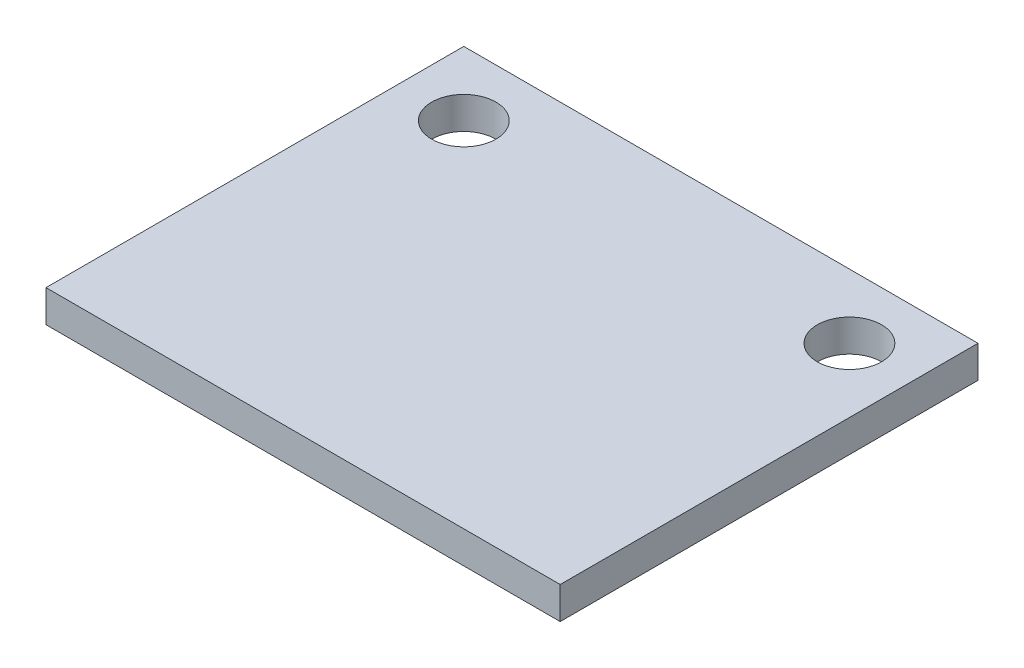
ISO-10303-21;
HEADER;
FILE_DESCRIPTION(('STEP AP214'),'2;1');
FILE_NAME('part.step','',(''),(''),'','','');
FILE_SCHEMA(('AUTOMOTIVE_DESIGN { 1 0 10303 214 1 1 1 1 }'));
ENDSEC;
DATA;
#1=APPLICATION_CONTEXT('core data for automotive mechanical design processes');
#2=APPLICATION_PROTOCOL_DEFINITION('international standard','automotive_design',2000,#1);
#3=PRODUCT_CONTEXT('',#1,'mechanical');
#4=PRODUCT('Part','Part','',(#3));
#5=PRODUCT_RELATED_PRODUCT_CATEGORY('part','',(#4));
#6=PRODUCT_DEFINITION_FORMATION('','',#4);
#7=PRODUCT_DEFINITION_CONTEXT('part definition',#1,'design');
#8=PRODUCT_DEFINITION('design','',#6,#7);
#9=PRODUCT_DEFINITION_SHAPE('','',#8);
#10=(LENGTH_UNIT() NAMED_UNIT(*) SI_UNIT(.MILLI.,.METRE.));
#11=(NAMED_UNIT(*) PLANE_ANGLE_UNIT() SI_UNIT($,.RADIAN.));
#12=(NAMED_UNIT(*) SI_UNIT($,.STERADIAN.) SOLID_ANGLE_UNIT());
#13=UNCERTAINTY_MEASURE_WITH_UNIT(LENGTH_MEASURE(1.E-05),#10,'distance_accuracy_value','');
#14=(GEOMETRIC_REPRESENTATION_CONTEXT(3) GLOBAL_UNCERTAINTY_ASSIGNED_CONTEXT((#13)) GLOBAL_UNIT_ASSIGNED_CONTEXT((#10,
#11,#12)) REPRESENTATION_CONTEXT('',''));
#15=CARTESIAN_POINT('',(0.,0.,0.));
#16=DIRECTION('',(0.,0.,1.));
#17=DIRECTION('',(1.,0.,0.));
#18=AXIS2_PLACEMENT_3D('',#15,#16,#17);
#19=CARTESIAN_POINT('',(4.00000000000001,2.75,-6.11924196099296));
#20=DIRECTION('',(-1.,0.,0.));
#21=DIRECTION('',(0.,0.,1.));
#22=AXIS2_PLACEMENT_3D('',#19,#20,#21);
#23=PLANE('',#22);
#24=DIRECTION('',(0.,0.,-1.));
#25=VECTOR('',#24,1.);
#26=CARTESIAN_POINT('',(4.00000000000001,2.25,-6.11924196099296));
#27=LINE('',#26,#25);
#28=CARTESIAN_POINT('',(4.00000000000001,2.25,-3.61924196099296));
#29=VERTEX_POINT('',#28);
#30=CARTESIAN_POINT('',(4.00000000000001,2.25,-10.119241960993));
#31=VERTEX_POINT('',#30);
#32=EDGE_CURVE('E121',#29,#31,#27,.T.);
#33=ORIENTED_EDGE('',*,*,#32,.T.);
#34=DIRECTION('',(0.,-1.,0.));
#35=VECTOR('',#34,1.);
#36=CARTESIAN_POINT('',(4.00000000000001,2.75,-10.119241960993));
#37=LINE('',#36,#35);
#38=CARTESIAN_POINT('',(4.00000000000001,2.75,-10.119241960993));
#39=VERTEX_POINT('',#38);
#40=EDGE_CURVE('E11',#39,#31,#37,.T.);
#41=ORIENTED_EDGE('',*,*,#40,.F.);
#42=DIRECTION('',(0.,0.,-1.));
#43=VECTOR('',#42,1.);
#44=CARTESIAN_POINT('',(4.00000000000001,2.75,-6.11924196099296));
#45=LINE('',#44,#43);
#46=CARTESIAN_POINT('',(4.00000000000001,2.75,-3.61924196099296));
#47=VERTEX_POINT('',#46);
#48=EDGE_CURVE('E85',#47,#39,#45,.T.);
#49=ORIENTED_EDGE('',*,*,#48,.F.);
#50=DIRECTION('',(0.,-1.,0.));
#51=VECTOR('',#50,1.);
#52=CARTESIAN_POINT('',(4.00000000000001,2.75,-3.61924196099296));
#53=LINE('',#52,#51);
#54=EDGE_CURVE('E120',#47,#29,#53,.T.);
#55=ORIENTED_EDGE('',*,*,#54,.T.);
#56=EDGE_LOOP('',(#33,#41,#49,#55));
#57=FACE_BOUND('',#56,.T.);
#58=ADVANCED_FACE('F45',(#57),#23,.F.);
#59=CARTESIAN_POINT('',(0.,2.75,-10.119241960993));
#60=DIRECTION('',(0.,0.,-1.));
#61=DIRECTION('',(-1.,0.,0.));
#62=AXIS2_PLACEMENT_3D('',#59,#60,#61);
#63=PLANE('',#62);
#64=DIRECTION('',(1.,0.,0.));
#65=VECTOR('',#64,1.);
#66=CARTESIAN_POINT('',(0.,2.25,-10.119241960993));
#67=LINE('',#66,#65);
#68=CARTESIAN_POINT('',(-3.99999999999999,2.25,-10.119241960993));
#69=VERTEX_POINT('',#68);
#70=EDGE_CURVE('E94',#69,#31,#67,.T.);
#71=ORIENTED_EDGE('',*,*,#70,.F.);
#72=DIRECTION('',(0.,-1.,0.));
#73=VECTOR('',#72,1.);
#74=CARTESIAN_POINT('',(-3.99999999999999,2.75,-10.119241960993));
#75=LINE('',#74,#73);
#76=CARTESIAN_POINT('',(-3.99999999999999,2.75,-10.119241960993));
#77=VERTEX_POINT('',#76);
#78=EDGE_CURVE('E54',#77,#69,#75,.T.);
#79=ORIENTED_EDGE('',*,*,#78,.F.);
#80=DIRECTION('',(1.,0.,0.));
#81=VECTOR('',#80,1.);
#82=CARTESIAN_POINT('',(0.,2.75,-10.119241960993));
#83=LINE('',#82,#81);
#84=EDGE_CURVE('E92',#77,#39,#83,.T.);
#85=ORIENTED_EDGE('',*,*,#84,.T.);
#86=ORIENTED_EDGE('',*,*,#40,.T.);
#87=EDGE_LOOP('',(#71,#79,#85,#86));
#88=FACE_BOUND('',#87,.T.);
#89=ADVANCED_FACE('F91',(#88),#63,.T.);
#90=CARTESIAN_POINT('',(-3.99999999999999,2.75,-6.11924196099296));
#91=DIRECTION('',(-1.,0.,0.));
#92=DIRECTION('',(0.,0.,1.));
#93=AXIS2_PLACEMENT_3D('',#90,#91,#92);
#94=PLANE('',#93);
#95=DIRECTION('',(0.,0.,-1.));
#96=VECTOR('',#95,1.);
#97=CARTESIAN_POINT('',(-3.99999999999999,2.25,-6.11924196099296));
#98=LINE('',#97,#96);
#99=CARTESIAN_POINT('',(-3.99999999999999,2.25,-3.61924196099296));
#100=VERTEX_POINT('',#99);
#101=EDGE_CURVE('E127',#100,#69,#98,.T.);
#102=ORIENTED_EDGE('',*,*,#101,.F.);
#103=DIRECTION('',(0.,-1.,0.));
#104=VECTOR('',#103,1.);
#105=CARTESIAN_POINT('',(-3.99999999999999,2.75,-3.61924196099296));
#106=LINE('',#105,#104);
#107=CARTESIAN_POINT('',(-3.99999999999999,2.75,-3.61924196099296));
#108=VERTEX_POINT('',#107);
#109=EDGE_CURVE('E77',#108,#100,#106,.T.);
#110=ORIENTED_EDGE('',*,*,#109,.F.);
#111=DIRECTION('',(0.,0.,-1.));
#112=VECTOR('',#111,1.);
#113=CARTESIAN_POINT('',(-3.99999999999999,2.75,-6.11924196099296));
#114=LINE('',#113,#112);
#115=EDGE_CURVE('E102',#108,#77,#114,.T.);
#116=ORIENTED_EDGE('',*,*,#115,.T.);
#117=ORIENTED_EDGE('',*,*,#78,.T.);
#118=EDGE_LOOP('',(#102,#110,#116,#117));
#119=FACE_BOUND('',#118,.T.);
#120=ADVANCED_FACE('F105',(#119),#94,.T.);
#121=CARTESIAN_POINT('',(3.00000000000001,2.75,-9.11924196099296));
#122=DIRECTION('',(0.,-1.,0.));
#123=DIRECTION('',(0.,0.,-1.));
#124=AXIS2_PLACEMENT_3D('',#121,#122,#123);
#125=CYLINDRICAL_SURFACE('',#124,0.5);
#126=CARTESIAN_POINT('',(3.00000000000001,2.75,-9.11924196099296));
#127=DIRECTION('',(0.,1.,0.));
#128=DIRECTION('',(0.,0.,1.));
#129=AXIS2_PLACEMENT_3D('',#126,#127,#128);
#130=CIRCLE('',#129,0.5);
#131=CARTESIAN_POINT('',(3.00000000000001,2.75,-8.61924196099296));
#132=VERTEX_POINT('',#131);
#133=EDGE_CURVE('E109',#132,#132,#130,.F.);
#134=ORIENTED_EDGE('',*,*,#133,.F.);
#135=EDGE_LOOP('',(#134));
#136=FACE_BOUND('',#135,.T.);
#137=CARTESIAN_POINT('',(3.00000000000001,2.25,-9.11924196099296));
#138=DIRECTION('',(0.,1.,0.));
#139=DIRECTION('',(0.,0.,1.));
#140=AXIS2_PLACEMENT_3D('',#137,#138,#139);
#141=CIRCLE('',#140,0.5);
#142=CARTESIAN_POINT('',(3.00000000000001,2.25,-8.61924196099296));
#143=VERTEX_POINT('',#142);
#144=EDGE_CURVE('E132',#143,#143,#141,.F.);
#145=ORIENTED_EDGE('',*,*,#144,.T.);
#146=EDGE_LOOP('',(#145));
#147=FACE_BOUND('',#146,.T.);
#148=ADVANCED_FACE('F164',(#136,#147),#125,.F.);
#149=CARTESIAN_POINT('',(0.,2.75,-3.61924196099296));
#150=DIRECTION('',(0.,0.,-1.));
#151=DIRECTION('',(-1.,0.,0.));
#152=AXIS2_PLACEMENT_3D('',#149,#150,#151);
#153=PLANE('',#152);
#154=DIRECTION('',(1.,0.,0.));
#155=VECTOR('',#154,1.);
#156=CARTESIAN_POINT('',(0.,2.25,-3.61924196099296));
#157=LINE('',#156,#155);
#158=EDGE_CURVE('E80',#100,#29,#157,.T.);
#159=ORIENTED_EDGE('',*,*,#158,.T.);
#160=ORIENTED_EDGE('',*,*,#54,.F.);
#161=DIRECTION('',(1.,0.,0.));
#162=VECTOR('',#161,1.);
#163=CARTESIAN_POINT('',(0.,2.75,-3.61924196099296));
#164=LINE('',#163,#162);
#165=EDGE_CURVE('E62',#108,#47,#164,.T.);
#166=ORIENTED_EDGE('',*,*,#165,.F.);
#167=ORIENTED_EDGE('',*,*,#109,.T.);
#168=EDGE_LOOP('',(#159,#160,#166,#167));
#169=FACE_BOUND('',#168,.T.);
#170=ADVANCED_FACE('F156',(#169),#153,.F.);
#171=CARTESIAN_POINT('',(-2.99999999999999,2.75,-9.11924196099296));
#172=DIRECTION('',(0.,-1.,0.));
#173=DIRECTION('',(0.,0.,-1.));
#174=AXIS2_PLACEMENT_3D('',#171,#172,#173);
#175=CYLINDRICAL_SURFACE('',#174,0.5);
#176=CARTESIAN_POINT('',(-2.99999999999999,2.75,-9.11924196099296));
#177=DIRECTION('',(0.,1.,0.));
#178=DIRECTION('',(0.,0.,1.));
#179=AXIS2_PLACEMENT_3D('',#176,#177,#178);
#180=CIRCLE('',#179,0.5);
#181=CARTESIAN_POINT('',(-2.99999999999999,2.75,-8.61924196099296));
#182=VERTEX_POINT('',#181);
#183=EDGE_CURVE('E116',#182,#182,#180,.T.);
#184=ORIENTED_EDGE('',*,*,#183,.T.);
#185=EDGE_LOOP('',(#184));
#186=FACE_BOUND('',#185,.T.);
#187=CARTESIAN_POINT('',(-2.99999999999999,2.25,-9.11924196099296));
#188=DIRECTION('',(0.,1.,0.));
#189=DIRECTION('',(0.,0.,1.));
#190=AXIS2_PLACEMENT_3D('',#187,#188,#189);
#191=CIRCLE('',#190,0.5);
#192=CARTESIAN_POINT('',(-2.99999999999999,2.25,-8.61924196099296));
#193=VERTEX_POINT('',#192);
#194=EDGE_CURVE('E136',#193,#193,#191,.T.);
#195=ORIENTED_EDGE('',*,*,#194,.F.);
#196=EDGE_LOOP('',(#195));
#197=FACE_BOUND('',#196,.T.);
#198=ADVANCED_FACE('F154',(#186,#197),#175,.F.);
#199=CARTESIAN_POINT('',(0.,2.75,-6.11924196099296));
#200=DIRECTION('',(0.,1.,0.));
#201=DIRECTION('',(0.,0.,1.));
#202=AXIS2_PLACEMENT_3D('',#199,#200,#201);
#203=PLANE('',#202);
#204=ORIENTED_EDGE('',*,*,#48,.T.);
#205=ORIENTED_EDGE('',*,*,#84,.F.);
#206=ORIENTED_EDGE('',*,*,#115,.F.);
#207=ORIENTED_EDGE('',*,*,#165,.T.);
#208=EDGE_LOOP('',(#204,#205,#206,#207));
#209=FACE_BOUND('',#208,.T.);
#210=ORIENTED_EDGE('',*,*,#133,.T.);
#211=EDGE_LOOP('',(#210));
#212=FACE_BOUND('',#211,.T.);
#213=ORIENTED_EDGE('',*,*,#183,.F.);
#214=EDGE_LOOP('',(#213));
#215=FACE_BOUND('',#214,.T.);
#216=ADVANCED_FACE('F100',(#209,#212,#215),#203,.T.);
#217=CARTESIAN_POINT('',(0.,2.25,-6.11924196099296));
#218=DIRECTION('',(0.,1.,0.));
#219=DIRECTION('',(0.,0.,1.));
#220=AXIS2_PLACEMENT_3D('',#217,#218,#219);
#221=PLANE('',#220);
#222=ORIENTED_EDGE('',*,*,#32,.F.);
#223=ORIENTED_EDGE('',*,*,#158,.F.);
#224=ORIENTED_EDGE('',*,*,#101,.T.);
#225=ORIENTED_EDGE('',*,*,#70,.T.);
#226=EDGE_LOOP('',(#222,#223,#224,#225));
#227=FACE_BOUND('',#226,.T.);
#228=ORIENTED_EDGE('',*,*,#144,.F.);
#229=EDGE_LOOP('',(#228));
#230=FACE_BOUND('',#229,.T.);
#231=ORIENTED_EDGE('',*,*,#194,.T.);
#232=EDGE_LOOP('',(#231));
#233=FACE_BOUND('',#232,.T.);
#234=ADVANCED_FACE('F146',(#227,#230,#233),#221,.F.);
#235=CLOSED_SHELL('',(#58,#89,#120,#148,#170,#198,#216,#234));
#236=MANIFOLD_SOLID_BREP('B2',#235);
#237=ADVANCED_BREP_SHAPE_REPRESENTATION('',(#18,#236),#14);
#238=SHAPE_DEFINITION_REPRESENTATION(#9,#237);
ENDSEC;
END-ISO-10303-21;
